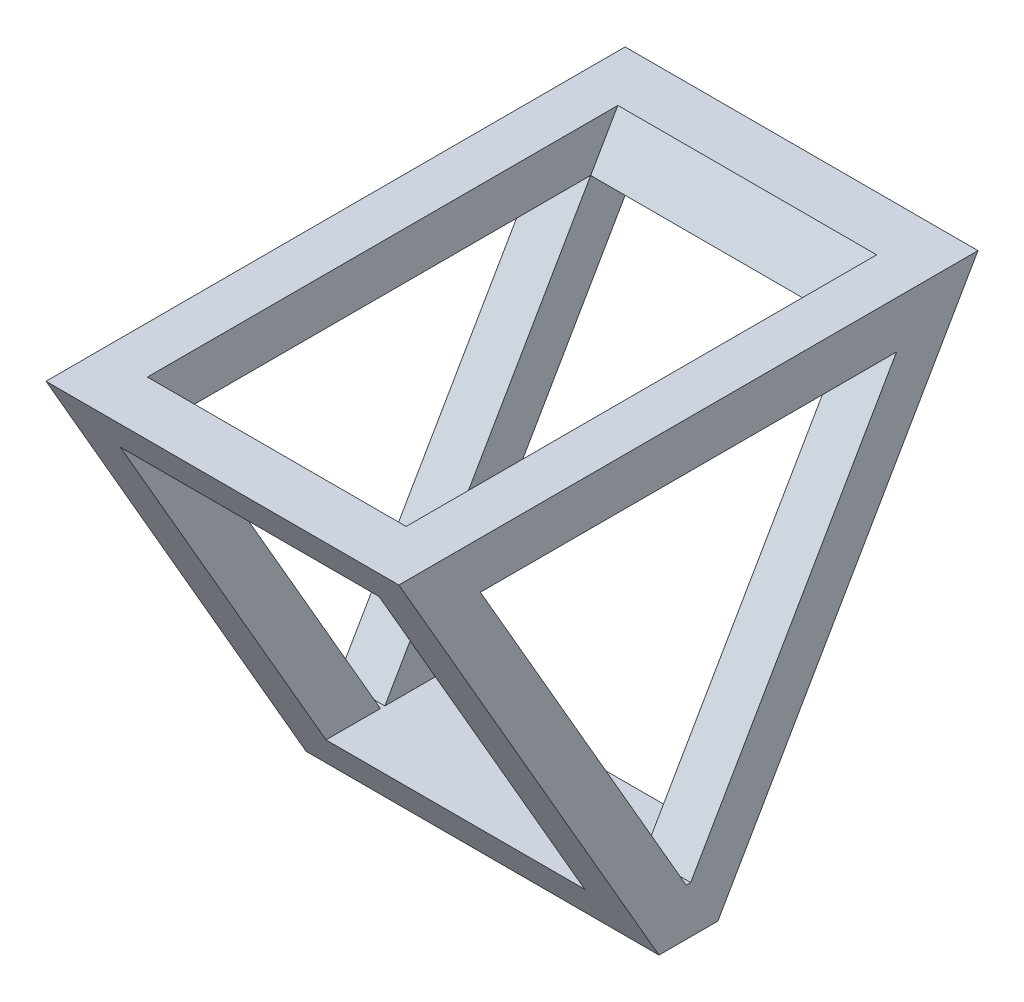
ISO-10303-21;
HEADER;
FILE_DESCRIPTION(('STEP AP214'),'2;1');
FILE_NAME('part.step','',(''),(''),'','','');
FILE_SCHEMA(('AUTOMOTIVE_DESIGN { 1 0 10303 214 1 1 1 1 }'));
ENDSEC;
DATA;
#1=APPLICATION_CONTEXT('core data for automotive mechanical design processes');
#2=APPLICATION_PROTOCOL_DEFINITION('international standard','automotive_design',2000,#1);
#3=PRODUCT_CONTEXT('',#1,'mechanical');
#4=PRODUCT('Part','Part','',(#3));
#5=PRODUCT_RELATED_PRODUCT_CATEGORY('part','',(#4));
#6=PRODUCT_DEFINITION_FORMATION('','',#4);
#7=PRODUCT_DEFINITION_CONTEXT('part definition',#1,'design');
#8=PRODUCT_DEFINITION('design','',#6,#7);
#9=PRODUCT_DEFINITION_SHAPE('','',#8);
#10=(LENGTH_UNIT() NAMED_UNIT(*) SI_UNIT(.MILLI.,.METRE.));
#11=(NAMED_UNIT(*) PLANE_ANGLE_UNIT() SI_UNIT($,.RADIAN.));
#12=(NAMED_UNIT(*) SI_UNIT($,.STERADIAN.) SOLID_ANGLE_UNIT());
#13=UNCERTAINTY_MEASURE_WITH_UNIT(LENGTH_MEASURE(1.E-05),#10,'distance_accuracy_value','');
#14=(GEOMETRIC_REPRESENTATION_CONTEXT(3) GLOBAL_UNCERTAINTY_ASSIGNED_CONTEXT((#13)) GLOBAL_UNIT_ASSIGNED_CONTEXT((#10,
#11,#12)) REPRESENTATION_CONTEXT('',''));
#15=CARTESIAN_POINT('',(0.,0.,0.));
#16=DIRECTION('',(0.,0.,1.));
#17=DIRECTION('',(1.,0.,0.));
#18=AXIS2_PLACEMENT_3D('',#15,#16,#17);
#19=CARTESIAN_POINT('',(30.,38.3108891324556,-20.));
#20=DIRECTION('',(0.,-0.499999999999998,-0.86602540378444));
#21=DIRECTION('',(0.,0.86602540378444,-0.499999999999998));
#22=AXIS2_PLACEMENT_3D('',#19,#20,#21);
#23=PLANE('',#22);
#24=DIRECTION('',(0.,-0.86602540378444,0.499999999999998));
#25=VECTOR('',#24,1.);
#26=CARTESIAN_POINT('',(26.,37.4498475662202,-19.5028774199506));
#27=LINE('',#26,#25);
#28=CARTESIAN_POINT('',(26.,38.3108891324556,-20.));
#29=VERTEX_POINT('',#28);
#30=CARTESIAN_POINT('',(26.,34.3108891324556,-17.6905989232415));
#31=VERTEX_POINT('',#30);
#32=EDGE_CURVE('E164',#29,#31,#27,.T.);
#33=ORIENTED_EDGE('',*,*,#32,.F.);
#34=DIRECTION('',(-1.,0.,0.));
#35=VECTOR('',#34,1.);
#36=CARTESIAN_POINT('',(30.,38.3108891324556,-20.));
#37=LINE('',#36,#35);
#38=CARTESIAN_POINT('',(4.,38.3108891324556,-20.));
#39=VERTEX_POINT('',#38);
#40=EDGE_CURVE('E58',#29,#39,#37,.T.);
#41=ORIENTED_EDGE('',*,*,#40,.T.);
#42=DIRECTION('',(0.,0.86602540378444,-0.499999999999998));
#43=VECTOR('',#42,1.);
#44=CARTESIAN_POINT('',(4.,40.4498475662203,-21.2349282275194));
#45=LINE('',#44,#43);
#46=CARTESIAN_POINT('',(4.,34.3108891324556,-17.6905989232415));
#47=VERTEX_POINT('',#46);
#48=EDGE_CURVE('E325',#47,#39,#45,.T.);
#49=ORIENTED_EDGE('',*,*,#48,.F.);
#50=DIRECTION('',(1.,0.,0.));
#51=VECTOR('',#50,1.);
#52=CARTESIAN_POINT('',(30.,34.3108891324556,-17.6905989232415));
#53=LINE('',#52,#51);
#54=EDGE_CURVE('E173',#47,#31,#53,.T.);
#55=ORIENTED_EDGE('',*,*,#54,.T.);
#56=EDGE_LOOP('',(#33,#41,#49,#55));
#57=FACE_BOUND('',#56,.T.);
#58=ADVANCED_FACE('F35',(#57),#23,.F.);
#59=DIRECTION('',(1.,0.,0.));
#60=VECTOR('',#59,1.);
#61=CARTESIAN_POINT('',(26.,34.3108891324556,-17.6905989232415));
#62=LINE('',#61,#60);
#63=CARTESIAN_POINT('',(30.,34.3108891324556,-17.6905989232415));
#64=VERTEX_POINT('',#63);
#65=EDGE_CURVE('E50',#31,#64,#62,.T.);
#66=ORIENTED_EDGE('',*,*,#65,.F.);
#67=DIRECTION('',(0.,-0.86602540378444,0.499999999999998));
#68=VECTOR('',#67,1.);
#69=CARTESIAN_POINT('',(26.,38.3108891324556,-20.));
#70=LINE('',#69,#68);
#71=CARTESIAN_POINT('',(26.,4.,-0.19059892324149));
#72=VERTEX_POINT('',#71);
#73=EDGE_CURVE('E238',#31,#72,#70,.T.);
#74=ORIENTED_EDGE('',*,*,#73,.T.);
#75=DIRECTION('',(-1.,0.,0.));
#76=VECTOR('',#75,1.);
#77=CARTESIAN_POINT('',(30.,4.,-0.190598923241489));
#78=LINE('',#77,#76);
#79=CARTESIAN_POINT('',(30.,4.,-0.190598923241489));
#80=VERTEX_POINT('',#79);
#81=EDGE_CURVE('E181',#80,#72,#78,.T.);
#82=ORIENTED_EDGE('',*,*,#81,.F.);
#83=DIRECTION('',(0.,-0.86602540378444,0.499999999999998));
#84=VECTOR('',#83,1.);
#85=CARTESIAN_POINT('',(30.,38.3108891324556,-20.));
#86=LINE('',#85,#84);
#87=EDGE_CURVE('E264',#64,#80,#86,.T.);
#88=ORIENTED_EDGE('',*,*,#87,.F.);
#89=EDGE_LOOP('',(#66,#74,#82,#88));
#90=FACE_BOUND('',#89,.T.);
#91=ADVANCED_FACE('F367',(#90),#23,.F.);
#92=CARTESIAN_POINT('',(30.,4.,0.190598923241489));
#93=DIRECTION('',(0.,-0.499999999999998,0.86602540378444));
#94=DIRECTION('',(0.,-0.86602540378444,-0.499999999999998));
#95=AXIS2_PLACEMENT_3D('',#92,#93,#94);
#96=PLANE('',#95);
#97=DIRECTION('',(0.,-0.86602540378444,-0.499999999999998));
#98=VECTOR('',#97,1.);
#99=CARTESIAN_POINT('',(26.,37.4498475662202,19.5028774199506));
#100=LINE('',#99,#98);
#101=CARTESIAN_POINT('',(26.,38.3108891324556,20.));
#102=VERTEX_POINT('',#101);
#103=CARTESIAN_POINT('',(26.,34.3108891324556,17.6905989232415));
#104=VERTEX_POINT('',#103);
#105=EDGE_CURVE('E166',#102,#104,#100,.T.);
#106=ORIENTED_EDGE('',*,*,#105,.T.);
#107=DIRECTION('',(-1.,0.,0.));
#108=VECTOR('',#107,1.);
#109=CARTESIAN_POINT('',(30.,34.3108891324556,17.6905989232415));
#110=LINE('',#109,#108);
#111=CARTESIAN_POINT('',(4.,34.3108891324556,17.6905989232415));
#112=VERTEX_POINT('',#111);
#113=EDGE_CURVE('E244',#104,#112,#110,.T.);
#114=ORIENTED_EDGE('',*,*,#113,.T.);
#115=DIRECTION('',(0.,0.86602540378444,0.499999999999998));
#116=VECTOR('',#115,1.);
#117=CARTESIAN_POINT('',(4.,40.4498475662203,21.2349282275195));
#118=LINE('',#117,#116);
#119=CARTESIAN_POINT('',(4.,38.3108891324556,20.));
#120=VERTEX_POINT('',#119);
#121=EDGE_CURVE('E232',#112,#120,#118,.T.);
#122=ORIENTED_EDGE('',*,*,#121,.T.);
#123=DIRECTION('',(-1.,0.,0.));
#124=VECTOR('',#123,1.);
#125=CARTESIAN_POINT('',(30.,38.3108891324556,20.));
#126=LINE('',#125,#124);
#127=EDGE_CURVE('E298',#102,#120,#126,.T.);
#128=ORIENTED_EDGE('',*,*,#127,.F.);
#129=EDGE_LOOP('',(#106,#114,#122,#128));
#130=FACE_BOUND('',#129,.T.);
#131=ADVANCED_FACE('F372',(#130),#96,.F.);
#132=DIRECTION('',(1.,0.,0.));
#133=VECTOR('',#132,1.);
#134=CARTESIAN_POINT('',(26.,34.3108891324556,17.6905989232415));
#135=LINE('',#134,#133);
#136=CARTESIAN_POINT('',(30.,34.3108891324556,17.6905989232415));
#137=VERTEX_POINT('',#136);
#138=EDGE_CURVE('E335',#104,#137,#135,.T.);
#139=ORIENTED_EDGE('',*,*,#138,.T.);
#140=DIRECTION('',(0.,0.86602540378444,0.499999999999998));
#141=VECTOR('',#140,1.);
#142=CARTESIAN_POINT('',(30.,4.,0.190598923241489));
#143=LINE('',#142,#141);
#144=CARTESIAN_POINT('',(30.,4.,0.190598923241489));
#145=VERTEX_POINT('',#144);
#146=EDGE_CURVE('E268',#145,#137,#143,.T.);
#147=ORIENTED_EDGE('',*,*,#146,.F.);
#148=DIRECTION('',(-1.,0.,0.));
#149=VECTOR('',#148,1.);
#150=CARTESIAN_POINT('',(30.,4.,0.190598923241489));
#151=LINE('',#150,#149);
#152=CARTESIAN_POINT('',(26.,4.,0.190598923241489));
#153=VERTEX_POINT('',#152);
#154=EDGE_CURVE('E300',#145,#153,#151,.T.);
#155=ORIENTED_EDGE('',*,*,#154,.T.);
#156=DIRECTION('',(0.,0.86602540378444,0.499999999999998));
#157=VECTOR('',#156,1.);
#158=CARTESIAN_POINT('',(26.,4.,0.190598923241489));
#159=LINE('',#158,#157);
#160=EDGE_CURVE('E235',#153,#104,#159,.T.);
#161=ORIENTED_EDGE('',*,*,#160,.T.);
#162=EDGE_LOOP('',(#139,#147,#155,#161));
#163=FACE_BOUND('',#162,.T.);
#164=ADVANCED_FACE('F343',(#163),#96,.F.);
#165=DIRECTION('',(1.,0.,0.));
#166=VECTOR('',#165,1.);
#167=CARTESIAN_POINT('',(0.,34.3108891324556,-17.6905989232415));
#168=LINE('',#167,#166);
#169=CARTESIAN_POINT('',(0.,34.3108891324556,-17.6905989232415));
#170=VERTEX_POINT('',#169);
#171=EDGE_CURVE('E328',#170,#47,#168,.T.);
#172=ORIENTED_EDGE('',*,*,#171,.F.);
#173=DIRECTION('',(0.,-0.86602540378444,0.499999999999998));
#174=VECTOR('',#173,1.);
#175=CARTESIAN_POINT('',(0.,38.3108891324556,-20.));
#176=LINE('',#175,#174);
#177=CARTESIAN_POINT('',(0.,4.,-0.190598923241489));
#178=VERTEX_POINT('',#177);
#179=EDGE_CURVE('E278',#170,#178,#176,.T.);
#180=ORIENTED_EDGE('',*,*,#179,.T.);
#181=CARTESIAN_POINT('',(4.,4.,-0.190598923241489));
#182=VERTEX_POINT('',#181);
#183=EDGE_CURVE('E187',#182,#178,#78,.T.);
#184=ORIENTED_EDGE('',*,*,#183,.F.);
#185=DIRECTION('',(0.,0.86602540378444,-0.499999999999998));
#186=VECTOR('',#185,1.);
#187=CARTESIAN_POINT('',(4.,38.3108891324556,-20.));
#188=LINE('',#187,#186);
#189=EDGE_CURVE('E251',#182,#47,#188,.T.);
#190=ORIENTED_EDGE('',*,*,#189,.T.);
#191=EDGE_LOOP('',(#172,#180,#184,#190));
#192=FACE_BOUND('',#191,.T.);
#193=ADVANCED_FACE('F368',(#192),#23,.F.);
#194=DIRECTION('',(1.,0.,0.));
#195=VECTOR('',#194,1.);
#196=CARTESIAN_POINT('',(0.,34.3108891324556,17.6905989232415));
#197=LINE('',#196,#195);
#198=CARTESIAN_POINT('',(0.,34.3108891324556,17.6905989232415));
#199=VERTEX_POINT('',#198);
#200=EDGE_CURVE('E331',#199,#112,#197,.T.);
#201=ORIENTED_EDGE('',*,*,#200,.T.);
#202=DIRECTION('',(0.,-0.86602540378444,-0.499999999999998));
#203=VECTOR('',#202,1.);
#204=CARTESIAN_POINT('',(4.,4.,0.190598923241488));
#205=LINE('',#204,#203);
#206=CARTESIAN_POINT('',(4.,4.,0.19059892324149));
#207=VERTEX_POINT('',#206);
#208=EDGE_CURVE('E214',#112,#207,#205,.T.);
#209=ORIENTED_EDGE('',*,*,#208,.T.);
#210=CARTESIAN_POINT('',(0.,4.,0.190598923241489));
#211=VERTEX_POINT('',#210);
#212=EDGE_CURVE('E299',#207,#211,#151,.T.);
#213=ORIENTED_EDGE('',*,*,#212,.T.);
#214=DIRECTION('',(0.,0.86602540378444,0.499999999999998));
#215=VECTOR('',#214,1.);
#216=CARTESIAN_POINT('',(0.,4.,0.190598923241489));
#217=LINE('',#216,#215);
#218=EDGE_CURVE('E283',#211,#199,#217,.T.);
#219=ORIENTED_EDGE('',*,*,#218,.T.);
#220=EDGE_LOOP('',(#201,#209,#213,#219));
#221=FACE_BOUND('',#220,.T.);
#222=ADVANCED_FACE('F308',(#221),#96,.F.);
#223=CARTESIAN_POINT('',(30.,0.,-2.5));
#224=DIRECTION('',(0.,0.499999999999998,0.86602540378444));
#225=DIRECTION('',(0.,-0.86602540378444,0.499999999999998));
#226=AXIS2_PLACEMENT_3D('',#223,#224,#225);
#227=PLANE('',#226);
#228=DIRECTION('',(-1.,0.,0.));
#229=VECTOR('',#228,1.);
#230=CARTESIAN_POINT('',(30.,34.3108891324556,-22.3094010767585));
#231=LINE('',#230,#229);
#232=CARTESIAN_POINT('',(26.,34.3108891324556,-22.3094010767585));
#233=VERTEX_POINT('',#232);
#234=CARTESIAN_POINT('',(4.,34.3108891324556,-22.3094010767585));
#235=VERTEX_POINT('',#234);
#236=EDGE_CURVE('E247',#233,#235,#231,.T.);
#237=ORIENTED_EDGE('',*,*,#236,.T.);
#238=DIRECTION('',(0.,-0.86602540378444,0.499999999999998));
#239=VECTOR('',#238,1.);
#240=CARTESIAN_POINT('',(4.,0.,-2.5));
#241=LINE('',#240,#239);
#242=CARTESIAN_POINT('',(4.,4.,-4.80940107675849));
#243=VERTEX_POINT('',#242);
#244=EDGE_CURVE('E254',#235,#243,#241,.T.);
#245=ORIENTED_EDGE('',*,*,#244,.T.);
#246=DIRECTION('',(1.,0.,0.));
#247=VECTOR('',#246,1.);
#248=CARTESIAN_POINT('',(30.,4.,-4.80940107675849));
#249=LINE('',#248,#247);
#250=CARTESIAN_POINT('',(26.,4.,-4.80940107675849));
#251=VERTEX_POINT('',#250);
#252=EDGE_CURVE('E219',#243,#251,#249,.T.);
#253=ORIENTED_EDGE('',*,*,#252,.T.);
#254=DIRECTION('',(0.,0.86602540378444,-0.499999999999998));
#255=VECTOR('',#254,1.);
#256=CARTESIAN_POINT('',(26.,0.,-2.5));
#257=LINE('',#256,#255);
#258=EDGE_CURVE('E241',#251,#233,#257,.T.);
#259=ORIENTED_EDGE('',*,*,#258,.T.);
#260=EDGE_LOOP('',(#237,#245,#253,#259));
#261=FACE_BOUND('',#260,.T.);
#262=DIRECTION('',(0.,0.86602540378444,-0.499999999999998));
#263=VECTOR('',#262,1.);
#264=CARTESIAN_POINT('',(0.,0.,-2.5));
#265=LINE('',#264,#263);
#266=CARTESIAN_POINT('',(0.,0.,-2.5));
#267=VERTEX_POINT('',#266);
#268=CARTESIAN_POINT('',(0.,38.3108891324556,-24.618802153517));
#269=VERTEX_POINT('',#268);
#270=EDGE_CURVE('E257',#267,#269,#265,.T.);
#271=ORIENTED_EDGE('',*,*,#270,.T.);
#272=DIRECTION('',(-1.,0.,0.));
#273=VECTOR('',#272,1.);
#274=CARTESIAN_POINT('',(30.,38.3108891324556,-24.618802153517));
#275=LINE('',#274,#273);
#276=CARTESIAN_POINT('',(30.,38.3108891324556,-24.618802153517));
#277=VERTEX_POINT('',#276);
#278=EDGE_CURVE('E180',#277,#269,#275,.T.);
#279=ORIENTED_EDGE('',*,*,#278,.F.);
#280=DIRECTION('',(0.,0.86602540378444,-0.499999999999998));
#281=VECTOR('',#280,1.);
#282=CARTESIAN_POINT('',(30.,0.,-2.5));
#283=LINE('',#282,#281);
#284=CARTESIAN_POINT('',(30.,0.,-2.5));
#285=VERTEX_POINT('',#284);
#286=EDGE_CURVE('E258',#285,#277,#283,.T.);
#287=ORIENTED_EDGE('',*,*,#286,.F.);
#288=DIRECTION('',(-1.,0.,0.));
#289=VECTOR('',#288,1.);
#290=CARTESIAN_POINT('',(30.,0.,-2.5));
#291=LINE('',#290,#289);
#292=EDGE_CURVE('E275',#285,#267,#291,.T.);
#293=ORIENTED_EDGE('',*,*,#292,.T.);
#294=EDGE_LOOP('',(#271,#279,#287,#293));
#295=FACE_BOUND('',#294,.T.);
#296=ADVANCED_FACE('F37',(#261,#295),#227,.F.);
#297=CARTESIAN_POINT('',(30.,4.,-0.190598923241489));
#298=DIRECTION('',(0.,-1.,0.));
#299=DIRECTION('',(0.,0.,-1.));
#300=AXIS2_PLACEMENT_3D('',#297,#298,#299);
#301=PLANE('',#300);
#302=ORIENTED_EDGE('',*,*,#81,.T.);
#303=DIRECTION('',(0.,0.,1.));
#304=VECTOR('',#303,1.);
#305=CARTESIAN_POINT('',(26.,4.,-24.618802153517));
#306=LINE('',#305,#304);
#307=EDGE_CURVE('E225',#251,#72,#306,.T.);
#308=ORIENTED_EDGE('',*,*,#307,.F.);
#309=ORIENTED_EDGE('',*,*,#252,.F.);
#310=DIRECTION('',(0.,0.,1.));
#311=VECTOR('',#310,1.);
#312=CARTESIAN_POINT('',(4.,4.,-24.618802153517));
#313=LINE('',#312,#311);
#314=EDGE_CURVE('E229',#243,#182,#313,.T.);
#315=ORIENTED_EDGE('',*,*,#314,.T.);
#316=ORIENTED_EDGE('',*,*,#183,.T.);
#317=DIRECTION('',(0.,0.,1.));
#318=VECTOR('',#317,1.);
#319=CARTESIAN_POINT('',(0.,4.,-0.190598923241489));
#320=LINE('',#319,#318);
#321=EDGE_CURVE('E280',#178,#211,#320,.T.);
#322=ORIENTED_EDGE('',*,*,#321,.T.);
#323=ORIENTED_EDGE('',*,*,#212,.F.);
#324=CARTESIAN_POINT('',(4.,4.,4.80940107675849));
#325=VERTEX_POINT('',#324);
#326=EDGE_CURVE('E230',#207,#325,#313,.T.);
#327=ORIENTED_EDGE('',*,*,#326,.T.);
#328=DIRECTION('',(-1.,0.,0.));
#329=VECTOR('',#328,1.);
#330=CARTESIAN_POINT('',(30.,4.,4.80940107675849));
#331=LINE('',#330,#329);
#332=CARTESIAN_POINT('',(26.,4.,4.80940107675849));
#333=VERTEX_POINT('',#332);
#334=EDGE_CURVE('E184',#333,#325,#331,.T.);
#335=ORIENTED_EDGE('',*,*,#334,.F.);
#336=EDGE_CURVE('E226',#153,#333,#306,.T.);
#337=ORIENTED_EDGE('',*,*,#336,.F.);
#338=ORIENTED_EDGE('',*,*,#154,.F.);
#339=DIRECTION('',(0.,0.,1.));
#340=VECTOR('',#339,1.);
#341=CARTESIAN_POINT('',(30.,4.,-0.190598923241489));
#342=LINE('',#341,#340);
#343=EDGE_CURVE('E266',#80,#145,#342,.T.);
#344=ORIENTED_EDGE('',*,*,#343,.F.);
#345=EDGE_LOOP('',(#302,#308,#309,#315,#316,#322,#323,#327,#335,#337,#338,#344));
#346=FACE_BOUND('',#345,.T.);
#347=ADVANCED_FACE('F313',(#346),#301,.F.);
#348=CARTESIAN_POINT('',(30.,38.3108891324556,20.));
#349=DIRECTION('',(0.,-1.,0.));
#350=DIRECTION('',(0.,0.,-1.));
#351=AXIS2_PLACEMENT_3D('',#348,#349,#350);
#352=PLANE('',#351);
#353=DIRECTION('',(0.,0.,-1.));
#354=VECTOR('',#353,1.);
#355=CARTESIAN_POINT('',(26.,38.3108891324556,24.9397129100779));
#356=LINE('',#355,#354);
#357=EDGE_CURVE('E161',#102,#29,#356,.T.);
#358=ORIENTED_EDGE('',*,*,#357,.F.);
#359=ORIENTED_EDGE('',*,*,#127,.T.);
#360=DIRECTION('',(0.,0.,-1.));
#361=VECTOR('',#360,1.);
#362=CARTESIAN_POINT('',(4.,38.3108891324556,24.9397129100779));
#363=LINE('',#362,#361);
#364=EDGE_CURVE('E178',#120,#39,#363,.T.);
#365=ORIENTED_EDGE('',*,*,#364,.T.);
#366=ORIENTED_EDGE('',*,*,#40,.F.);
#367=EDGE_LOOP('',(#358,#359,#365,#366));
#368=FACE_BOUND('',#367,.T.);
#369=DIRECTION('',(0.,0.,1.));
#370=VECTOR('',#369,1.);
#371=CARTESIAN_POINT('',(0.,38.3108891324556,20.));
#372=LINE('',#371,#370);
#373=CARTESIAN_POINT('',(0.,38.3108891324556,24.618802153517));
#374=VERTEX_POINT('',#373);
#375=EDGE_CURVE('E285',#269,#374,#372,.T.);
#376=ORIENTED_EDGE('',*,*,#375,.T.);
#377=DIRECTION('',(-1.,0.,0.));
#378=VECTOR('',#377,1.);
#379=CARTESIAN_POINT('',(30.,38.3108891324556,24.618802153517));
#380=LINE('',#379,#378);
#381=CARTESIAN_POINT('',(30.,38.3108891324556,24.618802153517));
#382=VERTEX_POINT('',#381);
#383=EDGE_CURVE('E295',#382,#374,#380,.T.);
#384=ORIENTED_EDGE('',*,*,#383,.F.);
#385=DIRECTION('',(0.,0.,1.));
#386=VECTOR('',#385,1.);
#387=CARTESIAN_POINT('',(30.,38.3108891324556,-24.618802153517));
#388=LINE('',#387,#386);
#389=EDGE_CURVE('E261',#277,#382,#388,.T.);
#390=ORIENTED_EDGE('',*,*,#389,.F.);
#391=ORIENTED_EDGE('',*,*,#278,.T.);
#392=EDGE_LOOP('',(#376,#384,#390,#391));
#393=FACE_BOUND('',#392,.T.);
#394=ADVANCED_FACE('F175',(#368,#393),#352,.F.);
#395=CARTESIAN_POINT('',(30.,38.3108891324556,24.618802153517));
#396=DIRECTION('',(0.,0.499999999999998,-0.86602540378444));
#397=DIRECTION('',(0.,0.86602540378444,0.499999999999998));
#398=AXIS2_PLACEMENT_3D('',#395,#396,#397);
#399=PLANE('',#398);
#400=ORIENTED_EDGE('',*,*,#334,.T.);
#401=DIRECTION('',(0.,0.86602540378444,0.499999999999998));
#402=VECTOR('',#401,1.);
#403=CARTESIAN_POINT('',(4.,38.3108891324556,24.618802153517));
#404=LINE('',#403,#402);
#405=CARTESIAN_POINT('',(4.,34.3108891324556,22.3094010767585));
#406=VERTEX_POINT('',#405);
#407=EDGE_CURVE('E11',#325,#406,#404,.T.);
#408=ORIENTED_EDGE('',*,*,#407,.T.);
#409=DIRECTION('',(1.,0.,0.));
#410=VECTOR('',#409,1.);
#411=CARTESIAN_POINT('',(30.,34.3108891324556,22.3094010767585));
#412=LINE('',#411,#410);
#413=CARTESIAN_POINT('',(26.,34.3108891324556,22.3094010767585));
#414=VERTEX_POINT('',#413);
#415=EDGE_CURVE('E43',#406,#414,#412,.T.);
#416=ORIENTED_EDGE('',*,*,#415,.T.);
#417=DIRECTION('',(0.,-0.86602540378444,-0.499999999999998));
#418=VECTOR('',#417,1.);
#419=CARTESIAN_POINT('',(26.,38.3108891324556,24.618802153517));
#420=LINE('',#419,#418);
#421=EDGE_CURVE('E193',#414,#333,#420,.T.);
#422=ORIENTED_EDGE('',*,*,#421,.T.);
#423=EDGE_LOOP('',(#400,#408,#416,#422));
#424=FACE_BOUND('',#423,.T.);
#425=DIRECTION('',(0.,-0.86602540378444,-0.499999999999998));
#426=VECTOR('',#425,1.);
#427=CARTESIAN_POINT('',(0.,38.3108891324556,24.618802153517));
#428=LINE('',#427,#426);
#429=CARTESIAN_POINT('',(0.,0.,2.5));
#430=VERTEX_POINT('',#429);
#431=EDGE_CURVE('E287',#374,#430,#428,.T.);
#432=ORIENTED_EDGE('',*,*,#431,.T.);
#433=DIRECTION('',(-1.,0.,0.));
#434=VECTOR('',#433,1.);
#435=CARTESIAN_POINT('',(30.,0.,2.5));
#436=LINE('',#435,#434);
#437=CARTESIAN_POINT('',(30.,0.,2.5));
#438=VERTEX_POINT('',#437);
#439=EDGE_CURVE('E292',#438,#430,#436,.T.);
#440=ORIENTED_EDGE('',*,*,#439,.F.);
#441=DIRECTION('',(0.,-0.86602540378444,-0.499999999999998));
#442=VECTOR('',#441,1.);
#443=CARTESIAN_POINT('',(30.,38.3108891324556,24.618802153517));
#444=LINE('',#443,#442);
#445=EDGE_CURVE('E271',#382,#438,#444,.T.);
#446=ORIENTED_EDGE('',*,*,#445,.F.);
#447=ORIENTED_EDGE('',*,*,#383,.T.);
#448=EDGE_LOOP('',(#432,#440,#446,#447));
#449=FACE_BOUND('',#448,.T.);
#450=ADVANCED_FACE('F197',(#424,#449),#399,.F.);
#451=CARTESIAN_POINT('',(30.,0.,2.5));
#452=DIRECTION('',(0.,1.,0.));
#453=DIRECTION('',(0.,0.,1.));
#454=AXIS2_PLACEMENT_3D('',#451,#452,#453);
#455=PLANE('',#454);
#456=DIRECTION('',(0.,0.,-1.));
#457=VECTOR('',#456,1.);
#458=CARTESIAN_POINT('',(0.,0.,2.5));
#459=LINE('',#458,#457);
#460=EDGE_CURVE('E262',#430,#267,#459,.T.);
#461=ORIENTED_EDGE('',*,*,#460,.T.);
#462=ORIENTED_EDGE('',*,*,#292,.F.);
#463=DIRECTION('',(0.,0.,-1.));
#464=VECTOR('',#463,1.);
#465=CARTESIAN_POINT('',(30.,0.,2.5));
#466=LINE('',#465,#464);
#467=EDGE_CURVE('E273',#438,#285,#466,.T.);
#468=ORIENTED_EDGE('',*,*,#467,.F.);
#469=ORIENTED_EDGE('',*,*,#439,.T.);
#470=EDGE_LOOP('',(#461,#462,#468,#469));
#471=FACE_BOUND('',#470,.T.);
#472=ADVANCED_FACE('F414',(#471),#455,.F.);
#473=CARTESIAN_POINT('',(30.,0.,0.));
#474=DIRECTION('',(1.,0.,0.));
#475=DIRECTION('',(0.,0.,-1.));
#476=AXIS2_PLACEMENT_3D('',#473,#474,#475);
#477=PLANE('',#476);
#478=ORIENTED_EDGE('',*,*,#389,.T.);
#479=ORIENTED_EDGE('',*,*,#445,.T.);
#480=ORIENTED_EDGE('',*,*,#467,.T.);
#481=ORIENTED_EDGE('',*,*,#286,.T.);
#482=EDGE_LOOP('',(#478,#479,#480,#481));
#483=FACE_BOUND('',#482,.T.);
#484=ORIENTED_EDGE('',*,*,#146,.T.);
#485=DIRECTION('',(0.,0.,-1.));
#486=VECTOR('',#485,1.);
#487=CARTESIAN_POINT('',(30.,34.3108891324556,24.9397129100779));
#488=LINE('',#487,#486);
#489=EDGE_CURVE('E337',#137,#64,#488,.T.);
#490=ORIENTED_EDGE('',*,*,#489,.T.);
#491=ORIENTED_EDGE('',*,*,#87,.T.);
#492=ORIENTED_EDGE('',*,*,#343,.T.);
#493=EDGE_LOOP('',(#484,#490,#491,#492));
#494=FACE_BOUND('',#493,.T.);
#495=ADVANCED_FACE('F346',(#483,#494),#477,.T.);
#496=CARTESIAN_POINT('',(0.,0.,0.));
#497=DIRECTION('',(1.,0.,0.));
#498=DIRECTION('',(0.,0.,-1.));
#499=AXIS2_PLACEMENT_3D('',#496,#497,#498);
#500=PLANE('',#499);
#501=DIRECTION('',(0.,0.,-1.));
#502=VECTOR('',#501,1.);
#503=CARTESIAN_POINT('',(0.,34.3108891324556,24.9397129100779));
#504=LINE('',#503,#502);
#505=EDGE_CURVE('E320',#199,#170,#504,.T.);
#506=ORIENTED_EDGE('',*,*,#505,.F.);
#507=ORIENTED_EDGE('',*,*,#218,.F.);
#508=ORIENTED_EDGE('',*,*,#321,.F.);
#509=ORIENTED_EDGE('',*,*,#179,.F.);
#510=EDGE_LOOP('',(#506,#507,#508,#509));
#511=FACE_BOUND('',#510,.T.);
#512=ORIENTED_EDGE('',*,*,#270,.F.);
#513=ORIENTED_EDGE('',*,*,#460,.F.);
#514=ORIENTED_EDGE('',*,*,#431,.F.);
#515=ORIENTED_EDGE('',*,*,#375,.F.);
#516=EDGE_LOOP('',(#512,#513,#514,#515));
#517=FACE_BOUND('',#516,.T.);
#518=ADVANCED_FACE('F317',(#511,#517),#500,.F.);
#519=CARTESIAN_POINT('',(26.,34.3108891324556,-24.618802153517));
#520=DIRECTION('',(1.,0.,0.));
#521=DIRECTION('',(0.,1.,0.));
#522=AXIS2_PLACEMENT_3D('',#519,#520,#521);
#523=PLANE('',#522);
#524=ORIENTED_EDGE('',*,*,#336,.T.);
#525=ORIENTED_EDGE('',*,*,#421,.F.);
#526=DIRECTION('',(0.,0.,1.));
#527=VECTOR('',#526,1.);
#528=CARTESIAN_POINT('',(26.,34.3108891324556,-24.618802153517));
#529=LINE('',#528,#527);
#530=EDGE_CURVE('E209',#104,#414,#529,.T.);
#531=ORIENTED_EDGE('',*,*,#530,.F.);
#532=ORIENTED_EDGE('',*,*,#160,.F.);
#533=EDGE_LOOP('',(#524,#525,#531,#532));
#534=FACE_BOUND('',#533,.T.);
#535=ADVANCED_FACE('F351',(#534),#523,.F.);
#536=CARTESIAN_POINT('',(4.,34.3108891324556,-24.618802153517));
#537=DIRECTION('',(0.,1.,0.));
#538=DIRECTION('',(0.,0.,1.));
#539=AXIS2_PLACEMENT_3D('',#536,#537,#538);
#540=PLANE('',#539);
#541=ORIENTED_EDGE('',*,*,#530,.T.);
#542=ORIENTED_EDGE('',*,*,#415,.F.);
#543=DIRECTION('',(0.,0.,1.));
#544=VECTOR('',#543,1.);
#545=CARTESIAN_POINT('',(4.,34.3108891324556,-24.618802153517));
#546=LINE('',#545,#544);
#547=EDGE_CURVE('E206',#112,#406,#546,.T.);
#548=ORIENTED_EDGE('',*,*,#547,.F.);
#549=ORIENTED_EDGE('',*,*,#113,.F.);
#550=EDGE_LOOP('',(#541,#542,#548,#549));
#551=FACE_BOUND('',#550,.T.);
#552=ADVANCED_FACE('F204',(#551),#540,.F.);
#553=CARTESIAN_POINT('',(4.,34.3108891324556,-24.618802153517));
#554=DIRECTION('',(-1.,0.,0.));
#555=DIRECTION('',(0.,-1.,0.));
#556=AXIS2_PLACEMENT_3D('',#553,#554,#555);
#557=PLANE('',#556);
#558=ORIENTED_EDGE('',*,*,#547,.T.);
#559=ORIENTED_EDGE('',*,*,#407,.F.);
#560=ORIENTED_EDGE('',*,*,#326,.F.);
#561=ORIENTED_EDGE('',*,*,#208,.F.);
#562=EDGE_LOOP('',(#558,#559,#560,#561));
#563=FACE_BOUND('',#562,.T.);
#564=ADVANCED_FACE('F212',(#563),#557,.F.);
#565=EDGE_CURVE('E215',#235,#47,#546,.T.);
#566=ORIENTED_EDGE('',*,*,#565,.T.);
#567=ORIENTED_EDGE('',*,*,#189,.F.);
#568=ORIENTED_EDGE('',*,*,#314,.F.);
#569=ORIENTED_EDGE('',*,*,#244,.F.);
#570=EDGE_LOOP('',(#566,#567,#568,#569));
#571=FACE_BOUND('',#570,.T.);
#572=ADVANCED_FACE('F422',(#571),#557,.F.);
#573=EDGE_CURVE('E216',#233,#31,#529,.T.);
#574=ORIENTED_EDGE('',*,*,#573,.T.);
#575=ORIENTED_EDGE('',*,*,#54,.F.);
#576=ORIENTED_EDGE('',*,*,#565,.F.);
#577=ORIENTED_EDGE('',*,*,#236,.F.);
#578=EDGE_LOOP('',(#574,#575,#576,#577));
#579=FACE_BOUND('',#578,.T.);
#580=ADVANCED_FACE('F360',(#579),#540,.F.);
#581=ORIENTED_EDGE('',*,*,#307,.T.);
#582=ORIENTED_EDGE('',*,*,#73,.F.);
#583=ORIENTED_EDGE('',*,*,#573,.F.);
#584=ORIENTED_EDGE('',*,*,#258,.F.);
#585=EDGE_LOOP('',(#581,#582,#583,#584));
#586=FACE_BOUND('',#585,.T.);
#587=ADVANCED_FACE('F354',(#586),#523,.F.);
#588=CARTESIAN_POINT('',(0.,34.3108891324556,24.9397129100779));
#589=DIRECTION('',(0.,1.,0.));
#590=DIRECTION('',(0.,0.,1.));
#591=AXIS2_PLACEMENT_3D('',#588,#589,#590);
#592=PLANE('',#591);
#593=ORIENTED_EDGE('',*,*,#200,.F.);
#594=ORIENTED_EDGE('',*,*,#505,.T.);
#595=ORIENTED_EDGE('',*,*,#171,.T.);
#596=DIRECTION('',(0.,0.,-1.));
#597=VECTOR('',#596,1.);
#598=CARTESIAN_POINT('',(4.,34.3108891324556,24.9397129100779));
#599=LINE('',#598,#597);
#600=EDGE_CURVE('E324',#112,#47,#599,.T.);
#601=ORIENTED_EDGE('',*,*,#600,.F.);
#602=EDGE_LOOP('',(#593,#594,#595,#601));
#603=FACE_BOUND('',#602,.T.);
#604=ADVANCED_FACE('F364',(#603),#592,.F.);
#605=CARTESIAN_POINT('',(4.,38.3108891324556,24.9397129100779));
#606=DIRECTION('',(-1.,0.,0.));
#607=DIRECTION('',(0.,0.,1.));
#608=AXIS2_PLACEMENT_3D('',#605,#606,#607);
#609=PLANE('',#608);
#610=ORIENTED_EDGE('',*,*,#121,.F.);
#611=ORIENTED_EDGE('',*,*,#600,.T.);
#612=ORIENTED_EDGE('',*,*,#48,.T.);
#613=ORIENTED_EDGE('',*,*,#364,.F.);
#614=EDGE_LOOP('',(#610,#611,#612,#613));
#615=FACE_BOUND('',#614,.T.);
#616=ADVANCED_FACE('F386',(#615),#609,.F.);
#617=CARTESIAN_POINT('',(26.,34.3108891324556,24.9397129100779));
#618=DIRECTION('',(1.,0.,0.));
#619=DIRECTION('',(0.,0.,-1.));
#620=AXIS2_PLACEMENT_3D('',#617,#618,#619);
#621=PLANE('',#620);
#622=ORIENTED_EDGE('',*,*,#105,.F.);
#623=ORIENTED_EDGE('',*,*,#357,.T.);
#624=ORIENTED_EDGE('',*,*,#32,.T.);
#625=DIRECTION('',(0.,0.,-1.));
#626=VECTOR('',#625,1.);
#627=CARTESIAN_POINT('',(26.,34.3108891324556,24.9397129100779));
#628=LINE('',#627,#626);
#629=EDGE_CURVE('E169',#104,#31,#628,.T.);
#630=ORIENTED_EDGE('',*,*,#629,.F.);
#631=EDGE_LOOP('',(#622,#623,#624,#630));
#632=FACE_BOUND('',#631,.T.);
#633=ADVANCED_FACE('F162',(#632),#621,.F.);
#634=CARTESIAN_POINT('',(26.,34.3108891324556,24.9397129100779));
#635=DIRECTION('',(0.,1.,0.));
#636=DIRECTION('',(0.,0.,1.));
#637=AXIS2_PLACEMENT_3D('',#634,#635,#636);
#638=PLANE('',#637);
#639=ORIENTED_EDGE('',*,*,#138,.F.);
#640=ORIENTED_EDGE('',*,*,#629,.T.);
#641=ORIENTED_EDGE('',*,*,#65,.T.);
#642=ORIENTED_EDGE('',*,*,#489,.F.);
#643=EDGE_LOOP('',(#639,#640,#641,#642));
#644=FACE_BOUND('',#643,.T.);
#645=ADVANCED_FACE('F567',(#644),#638,.F.);
#646=CLOSED_SHELL('',(#58,#91,#131,#164,#193,#222,#296,#347,#394,#450,#472,#495,#518,#535,#552,
#564,#572,#580,#587,#604,#616,#633,#645));
#647=MANIFOLD_SOLID_BREP('B2',#646);
#648=ADVANCED_BREP_SHAPE_REPRESENTATION('',(#18,#647),#14);
#649=SHAPE_DEFINITION_REPRESENTATION(#9,#648);
ENDSEC;
END-ISO-10303-21;
